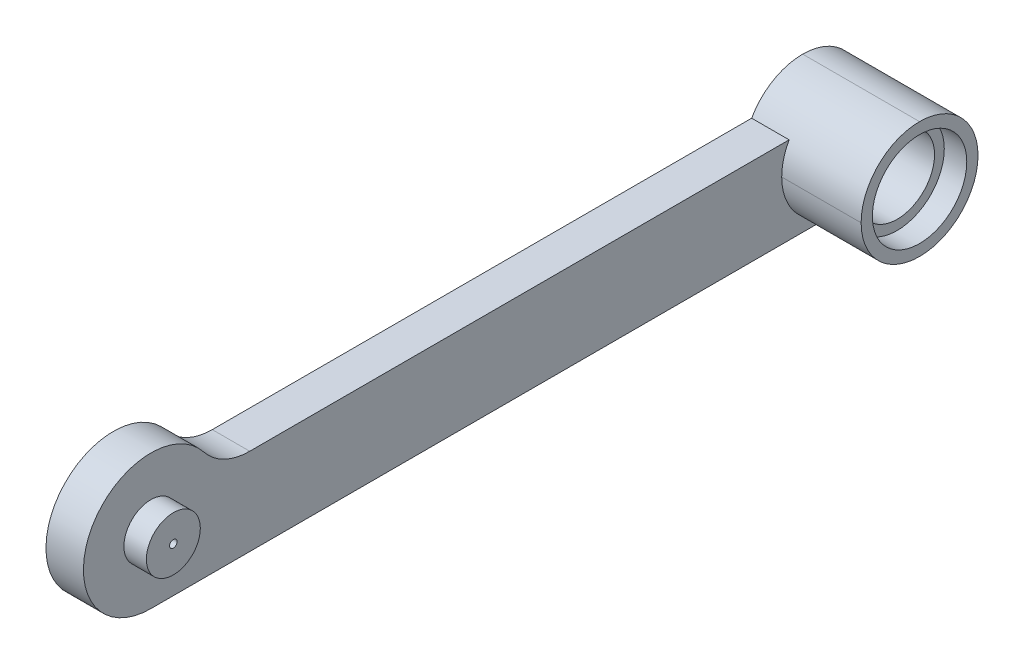
ISO-10303-21;
HEADER;
FILE_DESCRIPTION(('STEP AP214'),'2;1');
FILE_NAME('part.step','',(''),(''),'','','');
FILE_SCHEMA(('AUTOMOTIVE_DESIGN { 1 0 10303 214 1 1 1 1 }'));
ENDSEC;
DATA;
#1=APPLICATION_CONTEXT('core data for automotive mechanical design processes');
#2=APPLICATION_PROTOCOL_DEFINITION('international standard','automotive_design',2000,#1);
#3=PRODUCT_CONTEXT('',#1,'mechanical');
#4=PRODUCT('Part','Part','',(#3));
#5=PRODUCT_RELATED_PRODUCT_CATEGORY('part','',(#4));
#6=PRODUCT_DEFINITION_FORMATION('','',#4);
#7=PRODUCT_DEFINITION_CONTEXT('part definition',#1,'design');
#8=PRODUCT_DEFINITION('design','',#6,#7);
#9=PRODUCT_DEFINITION_SHAPE('','',#8);
#10=(LENGTH_UNIT() NAMED_UNIT(*) SI_UNIT(.MILLI.,.METRE.));
#11=(NAMED_UNIT(*) PLANE_ANGLE_UNIT() SI_UNIT($,.RADIAN.));
#12=(NAMED_UNIT(*) SI_UNIT($,.STERADIAN.) SOLID_ANGLE_UNIT());
#13=UNCERTAINTY_MEASURE_WITH_UNIT(LENGTH_MEASURE(1.E-05),#10,'distance_accuracy_value','');
#14=(GEOMETRIC_REPRESENTATION_CONTEXT(3) GLOBAL_UNCERTAINTY_ASSIGNED_CONTEXT((#13)) GLOBAL_UNIT_ASSIGNED_CONTEXT((#10,
#11,#12)) REPRESENTATION_CONTEXT('',''));
#15=CARTESIAN_POINT('',(0.,0.,0.));
#16=DIRECTION('',(0.,0.,1.));
#17=DIRECTION('',(1.,0.,0.));
#18=AXIS2_PLACEMENT_3D('',#15,#16,#17);
#19=CARTESIAN_POINT('',(0.,0.,0.));
#20=DIRECTION('',(1.,0.,0.));
#21=DIRECTION('',(0.,0.,-1.));
#22=AXIS2_PLACEMENT_3D('',#19,#20,#21);
#23=PLANE('',#22);
#24=CARTESIAN_POINT('',(0.,-0.6,-46.));
#25=DIRECTION('',(1.,0.,0.));
#26=DIRECTION('',(0.,0.,-1.));
#27=AXIS2_PLACEMENT_3D('',#24,#25,#26);
#28=CIRCLE('',#27,3.15);
#29=CARTESIAN_POINT('',(0.,-0.6,-49.15));
#30=VERTEX_POINT('',#29);
#31=EDGE_CURVE('E223',#30,#30,#28,.T.);
#32=ORIENTED_EDGE('',*,*,#31,.T.);
#33=EDGE_LOOP('',(#32));
#34=FACE_BOUND('',#33,.T.);
#35=DIRECTION('',(0.,0.,1.));
#36=VECTOR('',#35,1.);
#37=CARTESIAN_POINT('',(0.,1.3,0.));
#38=LINE('',#37,#36);
#39=CARTESIAN_POINT('',(0.,1.3,-42.5941227268147));
#40=VERTEX_POINT('',#39);
#41=CARTESIAN_POINT('',(0.,1.3,-6.59696900098826));
#42=VERTEX_POINT('',#41);
#43=EDGE_CURVE('E206',#40,#42,#38,.T.);
#44=ORIENTED_EDGE('',*,*,#43,.F.);
#45=CARTESIAN_POINT('',(0.,-0.6,-46.));
#46=DIRECTION('',(1.,0.,0.));
#47=DIRECTION('',(0.,0.,-1.));
#48=AXIS2_PLACEMENT_3D('',#45,#46,#47);
#49=CIRCLE('',#48,3.9);
#50=CARTESIAN_POINT('',(0.,3.3,-46.));
#51=VERTEX_POINT('',#50);
#52=EDGE_CURVE('E188',#40,#51,#49,.F.);
#53=ORIENTED_EDGE('',*,*,#52,.T.);
#54=CARTESIAN_POINT('',(0.,-0.6,-46.));
#55=DIRECTION('',(1.,0.,0.));
#56=DIRECTION('',(0.,0.,-1.));
#57=AXIS2_PLACEMENT_3D('',#54,#55,#56);
#58=CIRCLE('',#57,3.9);
#59=CARTESIAN_POINT('',(0.,-0.6,-49.9));
#60=VERTEX_POINT('',#59);
#61=EDGE_CURVE('E185',#51,#60,#58,.F.);
#62=ORIENTED_EDGE('',*,*,#61,.T.);
#63=CARTESIAN_POINT('',(0.,-0.6,-46.));
#64=DIRECTION('',(1.,0.,0.));
#65=DIRECTION('',(0.,0.,-1.));
#66=AXIS2_PLACEMENT_3D('',#63,#64,#65);
#67=CIRCLE('',#66,3.9);
#68=CARTESIAN_POINT('',(0.,-4.5,-46.));
#69=VERTEX_POINT('',#68);
#70=EDGE_CURVE('E161',#60,#69,#67,.F.);
#71=ORIENTED_EDGE('',*,*,#70,.T.);
#72=DIRECTION('',(0.,0.,-1.));
#73=VECTOR('',#72,1.);
#74=CARTESIAN_POINT('',(0.,-4.5,0.));
#75=LINE('',#74,#73);
#76=CARTESIAN_POINT('',(0.,-4.5,0.));
#77=VERTEX_POINT('',#76);
#78=EDGE_CURVE('E156',#77,#69,#75,.T.);
#79=ORIENTED_EDGE('',*,*,#78,.F.);
#80=CARTESIAN_POINT('',(0.,0.,0.));
#81=DIRECTION('',(1.,0.,0.));
#82=DIRECTION('',(0.,0.,-1.));
#83=AXIS2_PLACEMENT_3D('',#80,#81,#82);
#84=CIRCLE('',#83,4.5);
#85=CARTESIAN_POINT('',(0.,2.78571428571429,-3.53409053624371));
#86=VERTEX_POINT('',#85);
#87=EDGE_CURVE('E139',#86,#77,#84,.T.);
#88=ORIENTED_EDGE('',*,*,#87,.F.);
#89=CARTESIAN_POINT('',(0.,5.2,-6.59696900098826));
#90=DIRECTION('',(1.,0.,0.));
#91=DIRECTION('',(0.,0.,-1.));
#92=AXIS2_PLACEMENT_3D('',#89,#90,#91);
#93=CIRCLE('',#92,3.9);
#94=EDGE_CURVE('E190',#86,#42,#93,.T.);
#95=ORIENTED_EDGE('',*,*,#94,.T.);
#96=EDGE_LOOP('',(#44,#53,#62,#71,#79,#88,#95));
#97=FACE_BOUND('',#96,.T.);
#98=ADVANCED_FACE('F66',(#34,#97),#23,.F.);
#99=CARTESIAN_POINT('',(2.5,0.,0.));
#100=DIRECTION('',(1.,0.,0.));
#101=DIRECTION('',(0.,0.,-1.));
#102=AXIS2_PLACEMENT_3D('',#99,#100,#101);
#103=PLANE('',#102);
#104=CARTESIAN_POINT('',(2.5,0.,0.));
#105=DIRECTION('',(1.,0.,0.));
#106=DIRECTION('',(0.,0.,-1.));
#107=AXIS2_PLACEMENT_3D('',#104,#105,#106);
#108=CIRCLE('',#107,1.8);
#109=CARTESIAN_POINT('',(2.5,0.,-1.8));
#110=VERTEX_POINT('',#109);
#111=EDGE_CURVE('E166',#110,#110,#108,.T.);
#112=ORIENTED_EDGE('',*,*,#111,.F.);
#113=EDGE_LOOP('',(#112));
#114=FACE_BOUND('',#113,.T.);
#115=DIRECTION('',(0.,0.,-1.));
#116=VECTOR('',#115,1.);
#117=CARTESIAN_POINT('',(2.5,1.3,0.));
#118=LINE('',#117,#116);
#119=CARTESIAN_POINT('',(2.5,1.3,-6.59696900098826));
#120=VERTEX_POINT('',#119);
#121=CARTESIAN_POINT('',(2.5,1.3,-42.5941227268147));
#122=VERTEX_POINT('',#121);
#123=EDGE_CURVE('E82',#120,#122,#118,.T.);
#124=ORIENTED_EDGE('',*,*,#123,.F.);
#125=CARTESIAN_POINT('',(2.5,5.2,-6.59696900098826));
#126=DIRECTION('',(1.,0.,0.));
#127=DIRECTION('',(0.,0.,-1.));
#128=AXIS2_PLACEMENT_3D('',#125,#126,#127);
#129=CIRCLE('',#128,3.9);
#130=CARTESIAN_POINT('',(2.5,2.78571428571429,-3.53409053624371));
#131=VERTEX_POINT('',#130);
#132=EDGE_CURVE('E192',#120,#131,#129,.F.);
#133=ORIENTED_EDGE('',*,*,#132,.T.);
#134=CARTESIAN_POINT('',(2.5,0.,0.));
#135=DIRECTION('',(1.,0.,0.));
#136=DIRECTION('',(0.,0.,-1.));
#137=AXIS2_PLACEMENT_3D('',#134,#135,#136);
#138=CIRCLE('',#137,4.5);
#139=CARTESIAN_POINT('',(2.5,-4.5,0.));
#140=VERTEX_POINT('',#139);
#141=EDGE_CURVE('E149',#131,#140,#138,.T.);
#142=ORIENTED_EDGE('',*,*,#141,.T.);
#143=DIRECTION('',(0.,0.,-1.));
#144=VECTOR('',#143,1.);
#145=CARTESIAN_POINT('',(2.5,-4.5,0.));
#146=LINE('',#145,#144);
#147=CARTESIAN_POINT('',(2.5,-4.5,-46.));
#148=VERTEX_POINT('',#147);
#149=EDGE_CURVE('E150',#140,#148,#146,.T.);
#150=ORIENTED_EDGE('',*,*,#149,.T.);
#151=CARTESIAN_POINT('',(2.5,-0.6,-46.));
#152=DIRECTION('',(1.,0.,0.));
#153=DIRECTION('',(0.,0.,-1.));
#154=AXIS2_PLACEMENT_3D('',#151,#152,#153);
#155=CIRCLE('',#154,3.9);
#156=CARTESIAN_POINT('',(2.5,-0.6,-42.1));
#157=VERTEX_POINT('',#156);
#158=EDGE_CURVE('E194',#148,#157,#155,.F.);
#159=ORIENTED_EDGE('',*,*,#158,.T.);
#160=CARTESIAN_POINT('',(2.5,-0.6,-46.));
#161=DIRECTION('',(1.,0.,0.));
#162=DIRECTION('',(0.,0.,-1.));
#163=AXIS2_PLACEMENT_3D('',#160,#161,#162);
#164=CIRCLE('',#163,3.9);
#165=EDGE_CURVE('E75',#157,#122,#164,.F.);
#166=ORIENTED_EDGE('',*,*,#165,.T.);
#167=EDGE_LOOP('',(#124,#133,#142,#150,#159,#166));
#168=FACE_BOUND('',#167,.T.);
#169=ADVANCED_FACE('F240',(#114,#168),#103,.T.);
#170=CARTESIAN_POINT('',(7.8,-0.6,-46.));
#171=DIRECTION('',(-1.,0.,0.));
#172=DIRECTION('',(0.,0.,1.));
#173=AXIS2_PLACEMENT_3D('',#170,#171,#172);
#174=CYLINDRICAL_SURFACE('',#173,2.5);
#175=CARTESIAN_POINT('',(1.5,-0.6,-46.));
#176=DIRECTION('',(1.,0.,0.));
#177=DIRECTION('',(0.,0.,-1.));
#178=AXIS2_PLACEMENT_3D('',#175,#176,#177);
#179=CIRCLE('',#178,2.5);
#180=CARTESIAN_POINT('',(1.5,-0.6,-48.5));
#181=VERTEX_POINT('',#180);
#182=EDGE_CURVE('E226',#181,#181,#179,.T.);
#183=ORIENTED_EDGE('',*,*,#182,.F.);
#184=EDGE_LOOP('',(#183));
#185=FACE_BOUND('',#184,.T.);
#186=CARTESIAN_POINT('',(6.3,-0.6,-46.));
#187=DIRECTION('',(1.,0.,0.));
#188=DIRECTION('',(0.,0.,-1.));
#189=AXIS2_PLACEMENT_3D('',#186,#187,#188);
#190=CIRCLE('',#189,2.5);
#191=CARTESIAN_POINT('',(6.3,-0.6,-48.5));
#192=VERTEX_POINT('',#191);
#193=EDGE_CURVE('E214',#192,#192,#190,.T.);
#194=ORIENTED_EDGE('',*,*,#193,.T.);
#195=EDGE_LOOP('',(#194));
#196=FACE_BOUND('',#195,.T.);
#197=ADVANCED_FACE('F263',(#185,#196),#174,.F.);
#198=CARTESIAN_POINT('',(2.5,0.,0.));
#199=DIRECTION('',(-1.,0.,0.));
#200=DIRECTION('',(0.,0.,1.));
#201=AXIS2_PLACEMENT_3D('',#198,#199,#200);
#202=CYLINDRICAL_SURFACE('',#201,4.5);
#203=ORIENTED_EDGE('',*,*,#141,.F.);
#204=DIRECTION('',(-1.,0.,0.));
#205=VECTOR('',#204,1.);
#206=CARTESIAN_POINT('',(2.5,2.78571428571429,-3.53409053624371));
#207=LINE('',#206,#205);
#208=EDGE_CURVE('E146',#131,#86,#207,.T.);
#209=ORIENTED_EDGE('',*,*,#208,.T.);
#210=ORIENTED_EDGE('',*,*,#87,.T.);
#211=DIRECTION('',(-1.,0.,0.));
#212=VECTOR('',#211,1.);
#213=CARTESIAN_POINT('',(2.5,-4.5,0.));
#214=LINE('',#213,#212);
#215=EDGE_CURVE('E143',#140,#77,#214,.T.);
#216=ORIENTED_EDGE('',*,*,#215,.F.);
#217=EDGE_LOOP('',(#203,#209,#210,#216));
#218=FACE_BOUND('',#217,.T.);
#219=ADVANCED_FACE('F142',(#218),#202,.T.);
#220=CARTESIAN_POINT('',(2.5,-4.5,0.));
#221=DIRECTION('',(0.,1.,0.));
#222=DIRECTION('',(0.,0.,1.));
#223=AXIS2_PLACEMENT_3D('',#220,#221,#222);
#224=PLANE('',#223);
#225=DIRECTION('',(-1.,0.,0.));
#226=VECTOR('',#225,1.);
#227=CARTESIAN_POINT('',(2.5,-4.5,-46.));
#228=LINE('',#227,#226);
#229=EDGE_CURVE('E174',#69,#148,#228,.F.);
#230=ORIENTED_EDGE('',*,*,#229,.T.);
#231=ORIENTED_EDGE('',*,*,#149,.F.);
#232=ORIENTED_EDGE('',*,*,#215,.T.);
#233=ORIENTED_EDGE('',*,*,#78,.T.);
#234=EDGE_LOOP('',(#230,#231,#232,#233));
#235=FACE_BOUND('',#234,.T.);
#236=ADVANCED_FACE('F155',(#235),#224,.F.);
#237=CARTESIAN_POINT('',(4.,0.,0.));
#238=DIRECTION('',(1.,0.,0.));
#239=DIRECTION('',(0.,0.,-1.));
#240=AXIS2_PLACEMENT_3D('',#237,#238,#239);
#241=PLANE('',#240);
#242=CARTESIAN_POINT('',(4.,0.,0.));
#243=DIRECTION('',(1.,0.,0.));
#244=DIRECTION('',(0.,0.,-1.));
#245=AXIS2_PLACEMENT_3D('',#242,#243,#244);
#246=CIRCLE('',#245,1.8);
#247=CARTESIAN_POINT('',(4.,0.,-1.8));
#248=VERTEX_POINT('',#247);
#249=EDGE_CURVE('E162',#248,#248,#246,.T.);
#250=ORIENTED_EDGE('',*,*,#249,.T.);
#251=EDGE_LOOP('',(#250));
#252=FACE_BOUND('',#251,.T.);
#253=CARTESIAN_POINT('',(4.,0.,0.));
#254=DIRECTION('',(1.,0.,0.));
#255=DIRECTION('',(0.,0.,-1.));
#256=AXIS2_PLACEMENT_3D('',#253,#254,#255);
#257=CIRCLE('',#256,0.25);
#258=CARTESIAN_POINT('',(4.,0.,-0.25));
#259=VERTEX_POINT('',#258);
#260=EDGE_CURVE('E232',#259,#259,#257,.T.);
#261=ORIENTED_EDGE('',*,*,#260,.F.);
#262=EDGE_LOOP('',(#261));
#263=FACE_BOUND('',#262,.T.);
#264=ADVANCED_FACE('F273',(#252,#263),#241,.T.);
#265=CARTESIAN_POINT('',(4.,0.,0.));
#266=DIRECTION('',(-1.,0.,0.));
#267=DIRECTION('',(0.,0.,1.));
#268=AXIS2_PLACEMENT_3D('',#265,#266,#267);
#269=CYLINDRICAL_SURFACE('',#268,1.8);
#270=ORIENTED_EDGE('',*,*,#249,.F.);
#271=EDGE_LOOP('',(#270));
#272=FACE_BOUND('',#271,.T.);
#273=ORIENTED_EDGE('',*,*,#111,.T.);
#274=EDGE_LOOP('',(#273));
#275=FACE_BOUND('',#274,.T.);
#276=ADVANCED_FACE('F301',(#272,#275),#269,.T.);
#277=CARTESIAN_POINT('',(4.,0.,0.));
#278=DIRECTION('',(-1.,0.,0.));
#279=DIRECTION('',(0.,0.,1.));
#280=AXIS2_PLACEMENT_3D('',#277,#278,#279);
#281=CYLINDRICAL_SURFACE('',#280,0.25);
#282=ORIENTED_EDGE('',*,*,#260,.T.);
#283=EDGE_LOOP('',(#282));
#284=FACE_BOUND('',#283,.T.);
#285=CARTESIAN_POINT('',(2.5,0.,0.));
#286=DIRECTION('',(1.,0.,0.));
#287=DIRECTION('',(0.,0.,-1.));
#288=AXIS2_PLACEMENT_3D('',#285,#286,#287);
#289=CIRCLE('',#288,0.25);
#290=CARTESIAN_POINT('',(2.5,0.,-0.25));
#291=VERTEX_POINT('',#290);
#292=EDGE_CURVE('E158',#291,#291,#289,.F.);
#293=ORIENTED_EDGE('',*,*,#292,.T.);
#294=EDGE_LOOP('',(#293));
#295=FACE_BOUND('',#294,.T.);
#296=ADVANCED_FACE('F294',(#284,#295),#281,.F.);
#297=ORIENTED_EDGE('',*,*,#292,.F.);
#298=EDGE_LOOP('',(#297));
#299=FACE_BOUND('',#298,.T.);
#300=ADVANCED_FACE('F266',(#299),#103,.T.);
#301=CARTESIAN_POINT('',(7.8,0.,0.));
#302=DIRECTION('',(1.,0.,0.));
#303=DIRECTION('',(0.,0.,-1.));
#304=AXIS2_PLACEMENT_3D('',#301,#302,#303);
#305=PLANE('',#304);
#306=CARTESIAN_POINT('',(7.8,-0.6,-46.));
#307=DIRECTION('',(1.,0.,0.));
#308=DIRECTION('',(0.,0.,-1.));
#309=AXIS2_PLACEMENT_3D('',#306,#307,#308);
#310=CIRCLE('',#309,3.15);
#311=CARTESIAN_POINT('',(7.8,-0.6,-49.15));
#312=VERTEX_POINT('',#311);
#313=EDGE_CURVE('E219',#312,#312,#310,.T.);
#314=ORIENTED_EDGE('',*,*,#313,.F.);
#315=EDGE_LOOP('',(#314));
#316=FACE_BOUND('',#315,.T.);
#317=CARTESIAN_POINT('',(7.8,-0.6,-46.));
#318=DIRECTION('',(1.,0.,0.));
#319=DIRECTION('',(0.,0.,-1.));
#320=AXIS2_PLACEMENT_3D('',#317,#318,#319);
#321=CIRCLE('',#320,3.9);
#322=CARTESIAN_POINT('',(7.8,3.3,-46.));
#323=VERTEX_POINT('',#322);
#324=CARTESIAN_POINT('',(7.8,-0.6,-42.1));
#325=VERTEX_POINT('',#324);
#326=EDGE_CURVE('E180',#323,#325,#321,.T.);
#327=ORIENTED_EDGE('',*,*,#326,.T.);
#328=CARTESIAN_POINT('',(7.8,-0.6,-46.));
#329=DIRECTION('',(1.,0.,0.));
#330=DIRECTION('',(0.,0.,-1.));
#331=AXIS2_PLACEMENT_3D('',#328,#329,#330);
#332=CIRCLE('',#331,3.9);
#333=CARTESIAN_POINT('',(7.8,-4.5,-46.));
#334=VERTEX_POINT('',#333);
#335=EDGE_CURVE('E182',#325,#334,#332,.T.);
#336=ORIENTED_EDGE('',*,*,#335,.T.);
#337=CARTESIAN_POINT('',(7.8,-0.6,-46.));
#338=DIRECTION('',(1.,0.,0.));
#339=DIRECTION('',(0.,0.,-1.));
#340=AXIS2_PLACEMENT_3D('',#337,#338,#339);
#341=CIRCLE('',#340,3.9);
#342=CARTESIAN_POINT('',(7.8,-0.6,-49.9));
#343=VERTEX_POINT('',#342);
#344=EDGE_CURVE('E178',#334,#343,#341,.T.);
#345=ORIENTED_EDGE('',*,*,#344,.T.);
#346=CARTESIAN_POINT('',(7.8,-0.6,-46.));
#347=DIRECTION('',(1.,0.,0.));
#348=DIRECTION('',(0.,0.,-1.));
#349=AXIS2_PLACEMENT_3D('',#346,#347,#348);
#350=CIRCLE('',#349,3.9);
#351=EDGE_CURVE('E176',#343,#323,#350,.T.);
#352=ORIENTED_EDGE('',*,*,#351,.T.);
#353=EDGE_LOOP('',(#327,#336,#345,#352));
#354=FACE_BOUND('',#353,.T.);
#355=ADVANCED_FACE('F281',(#316,#354),#305,.T.);
#356=CARTESIAN_POINT('',(1.5,-0.6,-46.));
#357=DIRECTION('',(-1.,0.,0.));
#358=DIRECTION('',(0.,0.,1.));
#359=AXIS2_PLACEMENT_3D('',#356,#357,#358);
#360=CYLINDRICAL_SURFACE('',#359,3.15);
#361=CARTESIAN_POINT('',(1.5,-0.6,-46.));
#362=DIRECTION('',(1.,0.,0.));
#363=DIRECTION('',(0.,0.,-1.));
#364=AXIS2_PLACEMENT_3D('',#361,#362,#363);
#365=CIRCLE('',#364,3.15);
#366=CARTESIAN_POINT('',(1.5,-0.6,-49.15));
#367=VERTEX_POINT('',#366);
#368=EDGE_CURVE('E229',#367,#367,#365,.T.);
#369=ORIENTED_EDGE('',*,*,#368,.T.);
#370=EDGE_LOOP('',(#369));
#371=FACE_BOUND('',#370,.T.);
#372=ORIENTED_EDGE('',*,*,#31,.F.);
#373=EDGE_LOOP('',(#372));
#374=FACE_BOUND('',#373,.T.);
#375=ADVANCED_FACE('F284',(#371,#374),#360,.F.);
#376=CARTESIAN_POINT('',(1.5,0.,0.));
#377=DIRECTION('',(1.,0.,0.));
#378=DIRECTION('',(0.,0.,-1.));
#379=AXIS2_PLACEMENT_3D('',#376,#377,#378);
#380=PLANE('',#379);
#381=ORIENTED_EDGE('',*,*,#182,.T.);
#382=EDGE_LOOP('',(#381));
#383=FACE_BOUND('',#382,.T.);
#384=ORIENTED_EDGE('',*,*,#368,.F.);
#385=EDGE_LOOP('',(#384));
#386=FACE_BOUND('',#385,.T.);
#387=ADVANCED_FACE('F291',(#383,#386),#380,.F.);
#388=CARTESIAN_POINT('',(6.3,-0.6,-46.));
#389=DIRECTION('',(1.,0.,0.));
#390=DIRECTION('',(0.,0.,-1.));
#391=AXIS2_PLACEMENT_3D('',#388,#389,#390);
#392=CYLINDRICAL_SURFACE('',#391,3.15);
#393=CARTESIAN_POINT('',(6.3,-0.6,-46.));
#394=DIRECTION('',(1.,0.,0.));
#395=DIRECTION('',(0.,0.,-1.));
#396=AXIS2_PLACEMENT_3D('',#393,#394,#395);
#397=CIRCLE('',#396,3.15);
#398=CARTESIAN_POINT('',(6.3,-0.6,-49.15));
#399=VERTEX_POINT('',#398);
#400=EDGE_CURVE('E220',#399,#399,#397,.T.);
#401=ORIENTED_EDGE('',*,*,#400,.F.);
#402=EDGE_LOOP('',(#401));
#403=FACE_BOUND('',#402,.T.);
#404=ORIENTED_EDGE('',*,*,#313,.T.);
#405=EDGE_LOOP('',(#404));
#406=FACE_BOUND('',#405,.T.);
#407=ADVANCED_FACE('F344',(#403,#406),#392,.F.);
#408=CARTESIAN_POINT('',(6.3,-0.6,-46.));
#409=DIRECTION('',(1.,0.,0.));
#410=DIRECTION('',(0.,0.,-1.));
#411=AXIS2_PLACEMENT_3D('',#408,#409,#410);
#412=PLANE('',#411);
#413=ORIENTED_EDGE('',*,*,#193,.F.);
#414=EDGE_LOOP('',(#413));
#415=FACE_BOUND('',#414,.T.);
#416=ORIENTED_EDGE('',*,*,#400,.T.);
#417=EDGE_LOOP('',(#416));
#418=FACE_BOUND('',#417,.T.);
#419=ADVANCED_FACE('F362',(#415,#418),#412,.T.);
#420=CARTESIAN_POINT('',(7.8,1.3,0.));
#421=DIRECTION('',(0.,-1.,0.));
#422=DIRECTION('',(0.,0.,-1.));
#423=AXIS2_PLACEMENT_3D('',#420,#421,#422);
#424=PLANE('',#423);
#425=ORIENTED_EDGE('',*,*,#43,.T.);
#426=DIRECTION('',(1.,0.,0.));
#427=VECTOR('',#426,1.);
#428=CARTESIAN_POINT('',(2.5,1.3,-6.59696900098826));
#429=LINE('',#428,#427);
#430=EDGE_CURVE('E172',#42,#120,#429,.T.);
#431=ORIENTED_EDGE('',*,*,#430,.T.);
#432=ORIENTED_EDGE('',*,*,#123,.T.);
#433=DIRECTION('',(-1.,0.,0.));
#434=VECTOR('',#433,1.);
#435=CARTESIAN_POINT('',(2.5,1.3,-42.5941227268147));
#436=LINE('',#435,#434);
#437=EDGE_CURVE('E12',#122,#40,#436,.T.);
#438=ORIENTED_EDGE('',*,*,#437,.T.);
#439=EDGE_LOOP('',(#425,#431,#432,#438));
#440=FACE_BOUND('',#439,.T.);
#441=ADVANCED_FACE('F246',(#440),#424,.F.);
#442=CARTESIAN_POINT('',(2.5,5.2,-6.59696900098826));
#443=DIRECTION('',(-1.,0.,0.));
#444=DIRECTION('',(0.,0.,1.));
#445=AXIS2_PLACEMENT_3D('',#442,#443,#444);
#446=CYLINDRICAL_SURFACE('',#445,3.9);
#447=ORIENTED_EDGE('',*,*,#132,.F.);
#448=ORIENTED_EDGE('',*,*,#430,.F.);
#449=ORIENTED_EDGE('',*,*,#94,.F.);
#450=ORIENTED_EDGE('',*,*,#208,.F.);
#451=EDGE_LOOP('',(#447,#448,#449,#450));
#452=FACE_BOUND('',#451,.T.);
#453=ADVANCED_FACE('F243',(#452),#446,.F.);
#454=CARTESIAN_POINT('',(2.5,-0.6,-46.));
#455=DIRECTION('',(1.,0.,0.));
#456=DIRECTION('',(0.,0.,-1.));
#457=AXIS2_PLACEMENT_3D('',#454,#455,#456);
#458=CYLINDRICAL_SURFACE('',#457,3.9);
#459=DIRECTION('',(-1.,0.,0.));
#460=VECTOR('',#459,1.);
#461=CARTESIAN_POINT('',(7.8,-0.6,-49.9));
#462=LINE('',#461,#460);
#463=EDGE_CURVE('E200',#60,#343,#462,.F.);
#464=ORIENTED_EDGE('',*,*,#463,.F.);
#465=ORIENTED_EDGE('',*,*,#61,.F.);
#466=DIRECTION('',(-1.,0.,0.));
#467=VECTOR('',#466,1.);
#468=CARTESIAN_POINT('',(0.,3.3,-46.));
#469=LINE('',#468,#467);
#470=EDGE_CURVE('E70',#323,#51,#469,.T.);
#471=ORIENTED_EDGE('',*,*,#470,.F.);
#472=ORIENTED_EDGE('',*,*,#351,.F.);
#473=EDGE_LOOP('',(#464,#465,#471,#472));
#474=FACE_BOUND('',#473,.T.);
#475=ADVANCED_FACE('F68',(#474),#458,.T.);
#476=CARTESIAN_POINT('',(7.8,-0.6,-46.));
#477=DIRECTION('',(-1.,0.,0.));
#478=DIRECTION('',(0.,0.,1.));
#479=AXIS2_PLACEMENT_3D('',#476,#477,#478);
#480=CYLINDRICAL_SURFACE('',#479,3.9);
#481=ORIENTED_EDGE('',*,*,#437,.F.);
#482=ORIENTED_EDGE('',*,*,#165,.F.);
#483=DIRECTION('',(-1.,0.,0.));
#484=VECTOR('',#483,1.);
#485=CARTESIAN_POINT('',(7.8,-0.6,-42.1));
#486=LINE('',#485,#484);
#487=EDGE_CURVE('E90',#325,#157,#486,.T.);
#488=ORIENTED_EDGE('',*,*,#487,.F.);
#489=ORIENTED_EDGE('',*,*,#326,.F.);
#490=ORIENTED_EDGE('',*,*,#470,.T.);
#491=ORIENTED_EDGE('',*,*,#52,.F.);
#492=EDGE_LOOP('',(#481,#482,#488,#489,#490,#491));
#493=FACE_BOUND('',#492,.T.);
#494=ADVANCED_FACE('F247',(#493),#480,.T.);
#495=CARTESIAN_POINT('',(2.5,-0.6,-46.));
#496=DIRECTION('',(-1.,0.,0.));
#497=DIRECTION('',(0.,0.,1.));
#498=AXIS2_PLACEMENT_3D('',#495,#496,#497);
#499=CYLINDRICAL_SURFACE('',#498,3.9);
#500=ORIENTED_EDGE('',*,*,#463,.T.);
#501=ORIENTED_EDGE('',*,*,#344,.F.);
#502=DIRECTION('',(-1.,0.,0.));
#503=VECTOR('',#502,1.);
#504=CARTESIAN_POINT('',(2.5,-4.5,-46.));
#505=LINE('',#504,#503);
#506=EDGE_CURVE('E198',#148,#334,#505,.F.);
#507=ORIENTED_EDGE('',*,*,#506,.F.);
#508=ORIENTED_EDGE('',*,*,#229,.F.);
#509=ORIENTED_EDGE('',*,*,#70,.F.);
#510=EDGE_LOOP('',(#500,#501,#507,#508,#509));
#511=FACE_BOUND('',#510,.T.);
#512=ADVANCED_FACE('F249',(#511),#499,.T.);
#513=CARTESIAN_POINT('',(2.5,-0.6,-46.));
#514=DIRECTION('',(1.,0.,0.));
#515=DIRECTION('',(0.,0.,-1.));
#516=AXIS2_PLACEMENT_3D('',#513,#514,#515);
#517=CYLINDRICAL_SURFACE('',#516,3.9);
#518=ORIENTED_EDGE('',*,*,#335,.F.);
#519=ORIENTED_EDGE('',*,*,#487,.T.);
#520=ORIENTED_EDGE('',*,*,#158,.F.);
#521=ORIENTED_EDGE('',*,*,#506,.T.);
#522=EDGE_LOOP('',(#518,#519,#520,#521));
#523=FACE_BOUND('',#522,.T.);
#524=ADVANCED_FACE('F254',(#523),#517,.T.);
#525=CLOSED_SHELL('',(#98,#169,#197,#219,#236,#264,#276,#296,#300,#355,#375,#387,#407,#419,#441,
#453,#475,#494,#512,#524));
#526=MANIFOLD_SOLID_BREP('B2',#525);
#527=ADVANCED_BREP_SHAPE_REPRESENTATION('',(#18,#526),#14);
#528=SHAPE_DEFINITION_REPRESENTATION(#9,#527);
ENDSEC;
END-ISO-10303-21;
